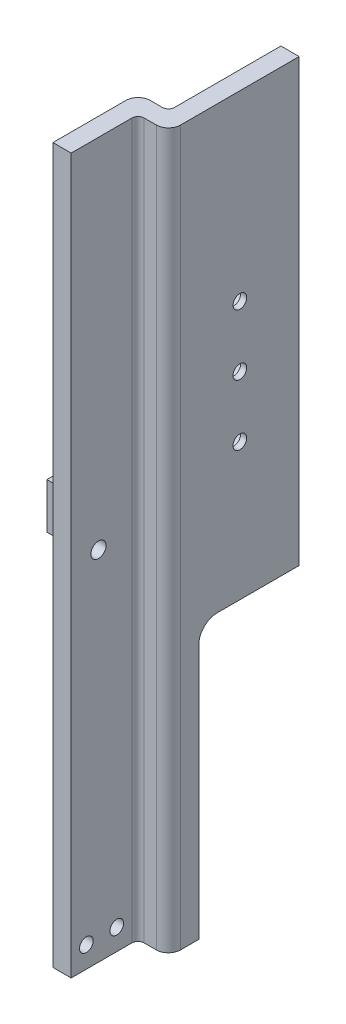
ISO-10303-21;
HEADER;
FILE_DESCRIPTION(('STEP AP214'),'2;1');
FILE_NAME('part.step','',(''),(''),'','','');
FILE_SCHEMA(('AUTOMOTIVE_DESIGN { 1 0 10303 214 1 1 1 1 }'));
ENDSEC;
DATA;
#1=APPLICATION_CONTEXT('core data for automotive mechanical design processes');
#2=APPLICATION_PROTOCOL_DEFINITION('international standard','automotive_design',2000,#1);
#3=PRODUCT_CONTEXT('',#1,'mechanical');
#4=PRODUCT('Part','Part','',(#3));
#5=PRODUCT_RELATED_PRODUCT_CATEGORY('part','',(#4));
#6=PRODUCT_DEFINITION_FORMATION('','',#4);
#7=PRODUCT_DEFINITION_CONTEXT('part definition',#1,'design');
#8=PRODUCT_DEFINITION('design','',#6,#7);
#9=PRODUCT_DEFINITION_SHAPE('','',#8);
#10=(LENGTH_UNIT() NAMED_UNIT(*) SI_UNIT(.MILLI.,.METRE.));
#11=(NAMED_UNIT(*) PLANE_ANGLE_UNIT() SI_UNIT($,.RADIAN.));
#12=(NAMED_UNIT(*) SI_UNIT($,.STERADIAN.) SOLID_ANGLE_UNIT());
#13=UNCERTAINTY_MEASURE_WITH_UNIT(LENGTH_MEASURE(1.E-05),#10,'distance_accuracy_value','');
#14=(GEOMETRIC_REPRESENTATION_CONTEXT(3) GLOBAL_UNCERTAINTY_ASSIGNED_CONTEXT((#13)) GLOBAL_UNIT_ASSIGNED_CONTEXT((#10,
#11,#12)) REPRESENTATION_CONTEXT('',''));
#15=CARTESIAN_POINT('',(0.,0.,0.));
#16=DIRECTION('',(0.,0.,1.));
#17=DIRECTION('',(1.,0.,0.));
#18=AXIS2_PLACEMENT_3D('',#15,#16,#17);
#19=CARTESIAN_POINT('',(-10.,0.,0.));
#20=DIRECTION('',(1.,0.,0.));
#21=DIRECTION('',(0.,0.,-1.));
#22=AXIS2_PLACEMENT_3D('',#19,#20,#21);
#23=PLANE('',#22);
#24=CARTESIAN_POINT('',(-10.,117.5,19.));
#25=DIRECTION('',(-1.,0.,0.));
#26=DIRECTION('',(0.,0.,1.));
#27=AXIS2_PLACEMENT_3D('',#24,#25,#26);
#28=CIRCLE('',#27,2.5);
#29=CARTESIAN_POINT('',(-10.,117.5,21.5));
#30=VERTEX_POINT('',#29);
#31=EDGE_CURVE('E445',#30,#30,#28,.T.);
#32=ORIENTED_EDGE('',*,*,#31,.F.);
#33=EDGE_LOOP('',(#32));
#34=FACE_BOUND('',#33,.T.);
#35=DIRECTION('',(0.,0.,1.));
#36=VECTOR('',#35,1.);
#37=CARTESIAN_POINT('',(-10.,110.,12.));
#38=LINE('',#37,#36);
#39=CARTESIAN_POINT('',(-10.,110.,4.));
#40=VERTEX_POINT('',#39);
#41=CARTESIAN_POINT('',(-10.,110.,15.));
#42=VERTEX_POINT('',#41);
#43=EDGE_CURVE('E62',#40,#42,#38,.T.);
#44=ORIENTED_EDGE('',*,*,#43,.F.);
#45=DIRECTION('',(0.,-1.,0.));
#46=VECTOR('',#45,1.);
#47=CARTESIAN_POINT('',(-10.,0.,4.));
#48=LINE('',#47,#46);
#49=CARTESIAN_POINT('',(-10.,0.,4.));
#50=VERTEX_POINT('',#49);
#51=EDGE_CURVE('E400',#40,#50,#48,.T.);
#52=ORIENTED_EDGE('',*,*,#51,.T.);
#53=DIRECTION('',(0.,0.,-1.));
#54=VECTOR('',#53,1.);
#55=CARTESIAN_POINT('',(-10.,0.,28.));
#56=LINE('',#55,#54);
#57=CARTESIAN_POINT('',(-10.,0.,28.));
#58=VERTEX_POINT('',#57);
#59=EDGE_CURVE('E338',#58,#50,#56,.T.);
#60=ORIENTED_EDGE('',*,*,#59,.F.);
#61=DIRECTION('',(0.,-1.,0.));
#62=VECTOR('',#61,1.);
#63=CARTESIAN_POINT('',(-10.,235.,28.));
#64=LINE('',#63,#62);
#65=CARTESIAN_POINT('',(-10.,235.,28.));
#66=VERTEX_POINT('',#65);
#67=EDGE_CURVE('E334',#66,#58,#64,.T.);
#68=ORIENTED_EDGE('',*,*,#67,.F.);
#69=DIRECTION('',(0.,0.,1.));
#70=VECTOR('',#69,1.);
#71=CARTESIAN_POINT('',(-10.,235.,-37.));
#72=LINE('',#71,#70);
#73=CARTESIAN_POINT('',(-10.,235.,4.));
#74=VERTEX_POINT('',#73);
#75=EDGE_CURVE('E343',#74,#66,#72,.T.);
#76=ORIENTED_EDGE('',*,*,#75,.F.);
#77=CARTESIAN_POINT('',(-10.,125.,4.));
#78=VERTEX_POINT('',#77);
#79=EDGE_CURVE('E401',#74,#78,#48,.T.);
#80=ORIENTED_EDGE('',*,*,#79,.T.);
#81=DIRECTION('',(0.,0.,-1.));
#82=VECTOR('',#81,1.);
#83=CARTESIAN_POINT('',(-10.,125.,12.));
#84=LINE('',#83,#82);
#85=CARTESIAN_POINT('',(-10.,125.,15.));
#86=VERTEX_POINT('',#85);
#87=EDGE_CURVE('E69',#86,#78,#84,.T.);
#88=ORIENTED_EDGE('',*,*,#87,.F.);
#89=DIRECTION('',(0.,1.,0.));
#90=VECTOR('',#89,1.);
#91=CARTESIAN_POINT('',(-10.,110.,15.));
#92=LINE('',#91,#90);
#93=EDGE_CURVE('E471',#42,#86,#92,.T.);
#94=ORIENTED_EDGE('',*,*,#93,.F.);
#95=EDGE_LOOP('',(#44,#52,#60,#68,#76,#80,#88,#94));
#96=FACE_BOUND('',#95,.T.);
#97=CARTESIAN_POINT('',(-10.,7.,13.));
#98=DIRECTION('',(1.,0.,0.));
#99=DIRECTION('',(0.,0.,-1.));
#100=AXIS2_PLACEMENT_3D('',#97,#98,#99);
#101=CIRCLE('',#100,2.24999999999997);
#102=CARTESIAN_POINT('',(-10.,7.,10.75));
#103=VERTEX_POINT('',#102);
#104=EDGE_CURVE('E228',#103,#103,#101,.T.);
#105=ORIENTED_EDGE('',*,*,#104,.T.);
#106=EDGE_LOOP('',(#105));
#107=FACE_BOUND('',#106,.T.);
#108=CARTESIAN_POINT('',(-10.,7.,23.));
#109=DIRECTION('',(1.,0.,0.));
#110=DIRECTION('',(0.,0.,-1.));
#111=AXIS2_PLACEMENT_3D('',#108,#109,#110);
#112=CIRCLE('',#111,2.24999999999997);
#113=CARTESIAN_POINT('',(-10.,7.,20.75));
#114=VERTEX_POINT('',#113);
#115=EDGE_CURVE('E215',#114,#114,#112,.T.);
#116=ORIENTED_EDGE('',*,*,#115,.T.);
#117=EDGE_LOOP('',(#116));
#118=FACE_BOUND('',#117,.T.);
#119=ADVANCED_FACE('F45',(#34,#96,#107,#118),#23,.F.);
#120=CARTESIAN_POINT('',(0.,235.,-37.));
#121=DIRECTION('',(1.,0.,0.));
#122=DIRECTION('',(0.,0.,-1.));
#123=AXIS2_PLACEMENT_3D('',#120,#121,#122);
#124=PLANE('',#123);
#125=CARTESIAN_POINT('',(0.,175.,-17.5));
#126=DIRECTION('',(-1.,0.,0.));
#127=DIRECTION('',(0.,0.,1.));
#128=AXIS2_PLACEMENT_3D('',#125,#126,#127);
#129=CIRCLE('',#128,4.);
#130=CARTESIAN_POINT('',(0.,175.,-13.5));
#131=VERTEX_POINT('',#130);
#132=EDGE_CURVE('E232',#131,#131,#129,.T.);
#133=ORIENTED_EDGE('',*,*,#132,.F.);
#134=EDGE_LOOP('',(#133));
#135=FACE_BOUND('',#134,.T.);
#136=CARTESIAN_POINT('',(0.,135.,-17.5));
#137=DIRECTION('',(-1.,0.,0.));
#138=DIRECTION('',(0.,0.,1.));
#139=AXIS2_PLACEMENT_3D('',#136,#137,#138);
#140=CIRCLE('',#139,4.);
#141=CARTESIAN_POINT('',(0.,135.,-13.5));
#142=VERTEX_POINT('',#141);
#143=EDGE_CURVE('E264',#142,#142,#140,.T.);
#144=ORIENTED_EDGE('',*,*,#143,.F.);
#145=EDGE_LOOP('',(#144));
#146=FACE_BOUND('',#145,.T.);
#147=DIRECTION('',(0.,0.,1.));
#148=VECTOR('',#147,1.);
#149=CARTESIAN_POINT('',(0.,0.,-37.));
#150=LINE('',#149,#148);
#151=CARTESIAN_POINT('',(0.,0.,-4.));
#152=VERTEX_POINT('',#151);
#153=CARTESIAN_POINT('',(0.,0.,-2.));
#154=VERTEX_POINT('',#153);
#155=EDGE_CURVE('E311',#152,#154,#150,.T.);
#156=ORIENTED_EDGE('',*,*,#155,.T.);
#157=DIRECTION('',(0.,-1.,0.));
#158=VECTOR('',#157,1.);
#159=CARTESIAN_POINT('',(0.,235.,-2.));
#160=LINE('',#159,#158);
#161=CARTESIAN_POINT('',(0.,235.,-2.));
#162=VERTEX_POINT('',#161);
#163=EDGE_CURVE('E378',#154,#162,#160,.F.);
#164=ORIENTED_EDGE('',*,*,#163,.T.);
#165=DIRECTION('',(0.,0.,1.));
#166=VECTOR('',#165,1.);
#167=CARTESIAN_POINT('',(0.,235.,-37.));
#168=LINE('',#167,#166);
#169=CARTESIAN_POINT('',(0.,235.,-37.));
#170=VERTEX_POINT('',#169);
#171=EDGE_CURVE('E314',#170,#162,#168,.T.);
#172=ORIENTED_EDGE('',*,*,#171,.F.);
#173=DIRECTION('',(0.,-1.,0.));
#174=VECTOR('',#173,1.);
#175=CARTESIAN_POINT('',(0.,235.,-37.));
#176=LINE('',#175,#174);
#177=CARTESIAN_POINT('',(0.,90.,-37.));
#178=VERTEX_POINT('',#177);
#179=EDGE_CURVE('E323',#170,#178,#176,.T.);
#180=ORIENTED_EDGE('',*,*,#179,.T.);
#181=DIRECTION('',(0.,0.,1.));
#182=VECTOR('',#181,1.);
#183=CARTESIAN_POINT('',(0.,90.,-37.));
#184=LINE('',#183,#182);
#185=CARTESIAN_POINT('',(0.,90.,-10.));
#186=VERTEX_POINT('',#185);
#187=EDGE_CURVE('E360',#178,#186,#184,.T.);
#188=ORIENTED_EDGE('',*,*,#187,.T.);
#189=CARTESIAN_POINT('',(0.,84.,-10.));
#190=DIRECTION('',(1.,0.,0.));
#191=DIRECTION('',(0.,0.,-1.));
#192=AXIS2_PLACEMENT_3D('',#189,#190,#191);
#193=CIRCLE('',#192,6.);
#194=CARTESIAN_POINT('',(0.,84.,-4.));
#195=VERTEX_POINT('',#194);
#196=EDGE_CURVE('E438',#186,#195,#193,.T.);
#197=ORIENTED_EDGE('',*,*,#196,.T.);
#198=DIRECTION('',(0.,-1.,0.));
#199=VECTOR('',#198,1.);
#200=CARTESIAN_POINT('',(0.,235.,-4.));
#201=LINE('',#200,#199);
#202=EDGE_CURVE('E371',#195,#152,#201,.T.);
#203=ORIENTED_EDGE('',*,*,#202,.T.);
#204=EDGE_LOOP('',(#156,#164,#172,#180,#188,#197,#203));
#205=FACE_BOUND('',#204,.T.);
#206=CARTESIAN_POINT('',(0.,155.,-17.5));
#207=DIRECTION('',(-1.,0.,0.));
#208=DIRECTION('',(0.,0.,1.));
#209=AXIS2_PLACEMENT_3D('',#206,#207,#208);
#210=CIRCLE('',#209,4.);
#211=CARTESIAN_POINT('',(0.,155.,-13.5));
#212=VERTEX_POINT('',#211);
#213=EDGE_CURVE('E248',#212,#212,#210,.T.);
#214=ORIENTED_EDGE('',*,*,#213,.F.);
#215=EDGE_LOOP('',(#214));
#216=FACE_BOUND('',#215,.T.);
#217=ADVANCED_FACE('F487',(#135,#146,#205,#216),#124,.F.);
#218=CARTESIAN_POINT('',(-10.,235.,28.));
#219=DIRECTION('',(0.,0.,1.));
#220=DIRECTION('',(1.,0.,0.));
#221=AXIS2_PLACEMENT_3D('',#218,#219,#220);
#222=PLANE('',#221);
#223=DIRECTION('',(0.,-1.,0.));
#224=VECTOR('',#223,1.);
#225=CARTESIAN_POINT('',(-4.,235.,28.));
#226=LINE('',#225,#224);
#227=CARTESIAN_POINT('',(-4.,235.,28.));
#228=VERTEX_POINT('',#227);
#229=CARTESIAN_POINT('',(-4.,0.,28.));
#230=VERTEX_POINT('',#229);
#231=EDGE_CURVE('E290',#228,#230,#226,.T.);
#232=ORIENTED_EDGE('',*,*,#231,.F.);
#233=DIRECTION('',(1.,0.,0.));
#234=VECTOR('',#233,1.);
#235=CARTESIAN_POINT('',(-10.,235.,28.));
#236=LINE('',#235,#234);
#237=EDGE_CURVE('E356',#66,#228,#236,.T.);
#238=ORIENTED_EDGE('',*,*,#237,.F.);
#239=ORIENTED_EDGE('',*,*,#67,.T.);
#240=DIRECTION('',(1.,0.,0.));
#241=VECTOR('',#240,1.);
#242=CARTESIAN_POINT('',(-10.,0.,28.));
#243=LINE('',#242,#241);
#244=EDGE_CURVE('E346',#58,#230,#243,.T.);
#245=ORIENTED_EDGE('',*,*,#244,.T.);
#246=EDGE_LOOP('',(#232,#238,#239,#245));
#247=FACE_BOUND('',#246,.T.);
#248=ADVANCED_FACE('F568',(#247),#222,.T.);
#249=CARTESIAN_POINT('',(-10.,235.,-37.));
#250=DIRECTION('',(0.,1.,0.));
#251=DIRECTION('',(0.,0.,1.));
#252=AXIS2_PLACEMENT_3D('',#249,#250,#251);
#253=PLANE('',#252);
#254=DIRECTION('',(-1.,0.,0.));
#255=VECTOR('',#254,1.);
#256=CARTESIAN_POINT('',(0.,235.,0.));
#257=LINE('',#256,#255);
#258=CARTESIAN_POINT('',(-2.,235.,0.));
#259=VERTEX_POINT('',#258);
#260=CARTESIAN_POINT('',(-6.,235.,0.));
#261=VERTEX_POINT('',#260);
#262=EDGE_CURVE('E318',#259,#261,#257,.T.);
#263=ORIENTED_EDGE('',*,*,#262,.T.);
#264=CARTESIAN_POINT('',(-6.,235.,4.));
#265=DIRECTION('',(0.,1.,0.));
#266=DIRECTION('',(0.,0.,1.));
#267=AXIS2_PLACEMENT_3D('',#264,#265,#266);
#268=CIRCLE('',#267,4.);
#269=EDGE_CURVE('E418',#261,#74,#268,.T.);
#270=ORIENTED_EDGE('',*,*,#269,.T.);
#271=ORIENTED_EDGE('',*,*,#75,.T.);
#272=ORIENTED_EDGE('',*,*,#237,.T.);
#273=DIRECTION('',(0.,0.,-1.));
#274=VECTOR('',#273,1.);
#275=CARTESIAN_POINT('',(-4.,235.,28.));
#276=LINE('',#275,#274);
#277=CARTESIAN_POINT('',(-4.,235.,8.));
#278=VERTEX_POINT('',#277);
#279=EDGE_CURVE('E281',#228,#278,#276,.T.);
#280=ORIENTED_EDGE('',*,*,#279,.T.);
#281=CARTESIAN_POINT('',(-2.,235.,8.));
#282=DIRECTION('',(0.,1.,0.));
#283=DIRECTION('',(0.,0.,1.));
#284=AXIS2_PLACEMENT_3D('',#281,#282,#283);
#285=CIRCLE('',#284,2.);
#286=CARTESIAN_POINT('',(-2.,235.,6.));
#287=VERTEX_POINT('',#286);
#288=EDGE_CURVE('E397',#278,#287,#285,.F.);
#289=ORIENTED_EDGE('',*,*,#288,.T.);
#290=DIRECTION('',(1.,0.,0.));
#291=VECTOR('',#290,1.);
#292=CARTESIAN_POINT('',(-4.,235.,6.));
#293=LINE('',#292,#291);
#294=CARTESIAN_POINT('',(2.,235.,6.));
#295=VERTEX_POINT('',#294);
#296=EDGE_CURVE('E285',#287,#295,#293,.T.);
#297=ORIENTED_EDGE('',*,*,#296,.T.);
#298=CARTESIAN_POINT('',(2.,235.,2.));
#299=DIRECTION('',(0.,1.,0.));
#300=DIRECTION('',(0.,0.,1.));
#301=AXIS2_PLACEMENT_3D('',#298,#299,#300);
#302=CIRCLE('',#301,4.);
#303=CARTESIAN_POINT('',(6.,235.,2.));
#304=VERTEX_POINT('',#303);
#305=EDGE_CURVE('E415',#295,#304,#302,.T.);
#306=ORIENTED_EDGE('',*,*,#305,.T.);
#307=DIRECTION('',(0.,0.,1.));
#308=VECTOR('',#307,1.);
#309=CARTESIAN_POINT('',(6.,235.,-37.));
#310=LINE('',#309,#308);
#311=CARTESIAN_POINT('',(6.,235.,-37.));
#312=VERTEX_POINT('',#311);
#313=EDGE_CURVE('E339',#312,#304,#310,.T.);
#314=ORIENTED_EDGE('',*,*,#313,.F.);
#315=DIRECTION('',(1.,0.,0.));
#316=VECTOR('',#315,1.);
#317=CARTESIAN_POINT('',(-10.,235.,-37.));
#318=LINE('',#317,#316);
#319=EDGE_CURVE('E361',#170,#312,#318,.T.);
#320=ORIENTED_EDGE('',*,*,#319,.F.);
#321=ORIENTED_EDGE('',*,*,#171,.T.);
#322=CARTESIAN_POINT('',(-2.,235.,-2.));
#323=DIRECTION('',(0.,1.,0.));
#324=DIRECTION('',(0.,0.,1.));
#325=AXIS2_PLACEMENT_3D('',#322,#323,#324);
#326=CIRCLE('',#325,2.);
#327=EDGE_CURVE('E391',#162,#259,#326,.F.);
#328=ORIENTED_EDGE('',*,*,#327,.T.);
#329=EDGE_LOOP('',(#263,#270,#271,#272,#280,#289,#297,#306,#314,#320,#321,#328));
#330=FACE_BOUND('',#329,.T.);
#331=ADVANCED_FACE('F575',(#330),#253,.T.);
#332=CARTESIAN_POINT('',(-10.,0.,-37.));
#333=DIRECTION('',(0.,0.,-1.));
#334=DIRECTION('',(-1.,0.,0.));
#335=AXIS2_PLACEMENT_3D('',#332,#333,#334);
#336=PLANE('',#335);
#337=DIRECTION('',(1.,0.,0.));
#338=VECTOR('',#337,1.);
#339=CARTESIAN_POINT('',(-10.,90.,-37.));
#340=LINE('',#339,#338);
#341=CARTESIAN_POINT('',(6.,90.,-37.));
#342=VERTEX_POINT('',#341);
#343=EDGE_CURVE('E306',#178,#342,#340,.T.);
#344=ORIENTED_EDGE('',*,*,#343,.F.);
#345=ORIENTED_EDGE('',*,*,#179,.F.);
#346=ORIENTED_EDGE('',*,*,#319,.T.);
#347=DIRECTION('',(0.,1.,0.));
#348=VECTOR('',#347,1.);
#349=CARTESIAN_POINT('',(6.,0.,-37.));
#350=LINE('',#349,#348);
#351=EDGE_CURVE('E350',#342,#312,#350,.T.);
#352=ORIENTED_EDGE('',*,*,#351,.F.);
#353=EDGE_LOOP('',(#344,#345,#346,#352));
#354=FACE_BOUND('',#353,.T.);
#355=ADVANCED_FACE('F578',(#354),#336,.T.);
#356=CARTESIAN_POINT('',(-10.,0.,28.));
#357=DIRECTION('',(0.,-1.,0.));
#358=DIRECTION('',(0.,0.,-1.));
#359=AXIS2_PLACEMENT_3D('',#356,#357,#358);
#360=PLANE('',#359);
#361=ORIENTED_EDGE('',*,*,#59,.T.);
#362=CARTESIAN_POINT('',(-6.,0.,4.));
#363=DIRECTION('',(0.,-1.,0.));
#364=DIRECTION('',(0.,0.,-1.));
#365=AXIS2_PLACEMENT_3D('',#362,#363,#364);
#366=CIRCLE('',#365,4.);
#367=CARTESIAN_POINT('',(-6.,0.,0.));
#368=VERTEX_POINT('',#367);
#369=EDGE_CURVE('E409',#50,#368,#366,.T.);
#370=ORIENTED_EDGE('',*,*,#369,.T.);
#371=DIRECTION('',(-1.,0.,0.));
#372=VECTOR('',#371,1.);
#373=CARTESIAN_POINT('',(0.,0.,0.));
#374=LINE('',#373,#372);
#375=CARTESIAN_POINT('',(-2.,0.,0.));
#376=VERTEX_POINT('',#375);
#377=EDGE_CURVE('E319',#376,#368,#374,.T.);
#378=ORIENTED_EDGE('',*,*,#377,.F.);
#379=CARTESIAN_POINT('',(-2.,0.,-2.));
#380=DIRECTION('',(0.,-1.,0.));
#381=DIRECTION('',(0.,0.,-1.));
#382=AXIS2_PLACEMENT_3D('',#379,#380,#381);
#383=CIRCLE('',#382,2.);
#384=EDGE_CURVE('E388',#376,#154,#383,.F.);
#385=ORIENTED_EDGE('',*,*,#384,.T.);
#386=ORIENTED_EDGE('',*,*,#155,.F.);
#387=DIRECTION('',(1.,0.,0.));
#388=VECTOR('',#387,1.);
#389=CARTESIAN_POINT('',(-10.,0.,-4.));
#390=LINE('',#389,#388);
#391=CARTESIAN_POINT('',(6.,0.,-4.));
#392=VERTEX_POINT('',#391);
#393=EDGE_CURVE('E307',#152,#392,#390,.T.);
#394=ORIENTED_EDGE('',*,*,#393,.T.);
#395=DIRECTION('',(0.,0.,-1.));
#396=VECTOR('',#395,1.);
#397=CARTESIAN_POINT('',(6.,0.,28.));
#398=LINE('',#397,#396);
#399=CARTESIAN_POINT('',(6.,0.,2.));
#400=VERTEX_POINT('',#399);
#401=EDGE_CURVE('E333',#400,#392,#398,.T.);
#402=ORIENTED_EDGE('',*,*,#401,.F.);
#403=CARTESIAN_POINT('',(2.,0.,2.));
#404=DIRECTION('',(0.,-1.,0.));
#405=DIRECTION('',(0.,0.,-1.));
#406=AXIS2_PLACEMENT_3D('',#403,#404,#405);
#407=CIRCLE('',#406,4.);
#408=CARTESIAN_POINT('',(2.,0.,6.));
#409=VERTEX_POINT('',#408);
#410=EDGE_CURVE('E405',#400,#409,#407,.T.);
#411=ORIENTED_EDGE('',*,*,#410,.T.);
#412=DIRECTION('',(1.,0.,0.));
#413=VECTOR('',#412,1.);
#414=CARTESIAN_POINT('',(-4.,0.,6.));
#415=LINE('',#414,#413);
#416=CARTESIAN_POINT('',(-2.,0.,6.));
#417=VERTEX_POINT('',#416);
#418=EDGE_CURVE('E286',#417,#409,#415,.T.);
#419=ORIENTED_EDGE('',*,*,#418,.F.);
#420=CARTESIAN_POINT('',(-2.,0.,8.));
#421=DIRECTION('',(0.,-1.,0.));
#422=DIRECTION('',(0.,0.,-1.));
#423=AXIS2_PLACEMENT_3D('',#420,#421,#422);
#424=CIRCLE('',#423,2.);
#425=CARTESIAN_POINT('',(-4.,0.,8.));
#426=VERTEX_POINT('',#425);
#427=EDGE_CURVE('E394',#417,#426,#424,.F.);
#428=ORIENTED_EDGE('',*,*,#427,.T.);
#429=DIRECTION('',(0.,0.,-1.));
#430=VECTOR('',#429,1.);
#431=CARTESIAN_POINT('',(-4.,0.,28.));
#432=LINE('',#431,#430);
#433=EDGE_CURVE('E280',#230,#426,#432,.T.);
#434=ORIENTED_EDGE('',*,*,#433,.F.);
#435=ORIENTED_EDGE('',*,*,#244,.F.);
#436=EDGE_LOOP('',(#361,#370,#378,#385,#386,#394,#402,#411,#419,#428,#434,#435));
#437=FACE_BOUND('',#436,.T.);
#438=ADVANCED_FACE('F573',(#437),#360,.T.);
#439=CARTESIAN_POINT('',(6.,0.,0.));
#440=DIRECTION('',(1.,0.,0.));
#441=DIRECTION('',(0.,0.,-1.));
#442=AXIS2_PLACEMENT_3D('',#439,#440,#441);
#443=PLANE('',#442);
#444=CARTESIAN_POINT('',(6.00000000000001,175.,-17.5));
#445=DIRECTION('',(-1.,0.,0.));
#446=DIRECTION('',(0.,0.,1.));
#447=AXIS2_PLACEMENT_3D('',#444,#445,#446);
#448=CIRCLE('',#447,2.25);
#449=CARTESIAN_POINT('',(6.00000000000001,175.,-15.25));
#450=VERTEX_POINT('',#449);
#451=EDGE_CURVE('E244',#450,#450,#448,.T.);
#452=ORIENTED_EDGE('',*,*,#451,.T.);
#453=EDGE_LOOP('',(#452));
#454=FACE_BOUND('',#453,.T.);
#455=CARTESIAN_POINT('',(6.00000000000001,155.,-17.5));
#456=DIRECTION('',(-1.,0.,0.));
#457=DIRECTION('',(0.,0.,1.));
#458=AXIS2_PLACEMENT_3D('',#455,#456,#457);
#459=CIRCLE('',#458,2.25);
#460=CARTESIAN_POINT('',(6.00000000000001,155.,-15.25));
#461=VERTEX_POINT('',#460);
#462=EDGE_CURVE('E260',#461,#461,#459,.T.);
#463=ORIENTED_EDGE('',*,*,#462,.T.);
#464=EDGE_LOOP('',(#463));
#465=FACE_BOUND('',#464,.T.);
#466=CARTESIAN_POINT('',(6.00000000000001,135.,-17.5));
#467=DIRECTION('',(-1.,0.,0.));
#468=DIRECTION('',(0.,0.,1.));
#469=AXIS2_PLACEMENT_3D('',#466,#467,#468);
#470=CIRCLE('',#469,2.25);
#471=CARTESIAN_POINT('',(6.00000000000001,135.,-15.25));
#472=VERTEX_POINT('',#471);
#473=EDGE_CURVE('E276',#472,#472,#470,.T.);
#474=ORIENTED_EDGE('',*,*,#473,.T.);
#475=EDGE_LOOP('',(#474));
#476=FACE_BOUND('',#475,.T.);
#477=ORIENTED_EDGE('',*,*,#313,.T.);
#478=DIRECTION('',(0.,-1.,0.));
#479=VECTOR('',#478,1.);
#480=CARTESIAN_POINT('',(6.,0.,2.));
#481=LINE('',#480,#479);
#482=EDGE_CURVE('E421',#304,#400,#481,.T.);
#483=ORIENTED_EDGE('',*,*,#482,.T.);
#484=ORIENTED_EDGE('',*,*,#401,.T.);
#485=DIRECTION('',(0.,-1.,0.));
#486=VECTOR('',#485,1.);
#487=CARTESIAN_POINT('',(6.,90.,-4.));
#488=LINE('',#487,#486);
#489=CARTESIAN_POINT('',(6.,84.,-4.));
#490=VERTEX_POINT('',#489);
#491=EDGE_CURVE('E303',#490,#392,#488,.T.);
#492=ORIENTED_EDGE('',*,*,#491,.F.);
#493=CARTESIAN_POINT('',(6.,84.,-10.));
#494=DIRECTION('',(1.,0.,0.));
#495=DIRECTION('',(0.,0.,-1.));
#496=AXIS2_PLACEMENT_3D('',#493,#494,#495);
#497=CIRCLE('',#496,6.);
#498=CARTESIAN_POINT('',(6.,90.,-10.));
#499=VERTEX_POINT('',#498);
#500=EDGE_CURVE('E435',#490,#499,#497,.F.);
#501=ORIENTED_EDGE('',*,*,#500,.T.);
#502=DIRECTION('',(0.,0.,1.));
#503=VECTOR('',#502,1.);
#504=CARTESIAN_POINT('',(6.,90.,-37.));
#505=LINE('',#504,#503);
#506=EDGE_CURVE('E299',#342,#499,#505,.T.);
#507=ORIENTED_EDGE('',*,*,#506,.F.);
#508=ORIENTED_EDGE('',*,*,#351,.T.);
#509=EDGE_LOOP('',(#477,#483,#484,#492,#501,#507,#508));
#510=FACE_BOUND('',#509,.T.);
#511=ADVANCED_FACE('F565',(#454,#465,#476,#510),#443,.T.);
#512=CARTESIAN_POINT('',(0.,235.,0.));
#513=DIRECTION('',(0.,0.,1.));
#514=DIRECTION('',(1.,0.,0.));
#515=AXIS2_PLACEMENT_3D('',#512,#513,#514);
#516=PLANE('',#515);
#517=ORIENTED_EDGE('',*,*,#377,.T.);
#518=DIRECTION('',(0.,-1.,0.));
#519=VECTOR('',#518,1.);
#520=CARTESIAN_POINT('',(-6.,235.,0.));
#521=LINE('',#520,#519);
#522=EDGE_CURVE('E412',#368,#261,#521,.F.);
#523=ORIENTED_EDGE('',*,*,#522,.T.);
#524=ORIENTED_EDGE('',*,*,#262,.F.);
#525=DIRECTION('',(0.,-1.,0.));
#526=VECTOR('',#525,1.);
#527=CARTESIAN_POINT('',(-2.,0.,0.));
#528=LINE('',#527,#526);
#529=EDGE_CURVE('E374',#259,#376,#528,.T.);
#530=ORIENTED_EDGE('',*,*,#529,.T.);
#531=EDGE_LOOP('',(#517,#523,#524,#530));
#532=FACE_BOUND('',#531,.T.);
#533=ADVANCED_FACE('F558',(#532),#516,.F.);
#534=CARTESIAN_POINT('',(-10.,90.,-4.));
#535=DIRECTION('',(0.,0.,1.));
#536=DIRECTION('',(1.,0.,0.));
#537=AXIS2_PLACEMENT_3D('',#534,#535,#536);
#538=PLANE('',#537);
#539=ORIENTED_EDGE('',*,*,#202,.F.);
#540=DIRECTION('',(1.,0.,0.));
#541=VECTOR('',#540,1.);
#542=CARTESIAN_POINT('',(6.,84.,-4.));
#543=LINE('',#542,#541);
#544=EDGE_CURVE('E428',#195,#490,#543,.T.);
#545=ORIENTED_EDGE('',*,*,#544,.T.);
#546=ORIENTED_EDGE('',*,*,#491,.T.);
#547=ORIENTED_EDGE('',*,*,#393,.F.);
#548=EDGE_LOOP('',(#539,#545,#546,#547));
#549=FACE_BOUND('',#548,.T.);
#550=ADVANCED_FACE('F555',(#549),#538,.F.);
#551=CARTESIAN_POINT('',(-10.,90.,-37.));
#552=DIRECTION('',(0.,1.,0.));
#553=DIRECTION('',(0.,0.,1.));
#554=AXIS2_PLACEMENT_3D('',#551,#552,#553);
#555=PLANE('',#554);
#556=ORIENTED_EDGE('',*,*,#506,.T.);
#557=DIRECTION('',(1.,0.,0.));
#558=VECTOR('',#557,1.);
#559=CARTESIAN_POINT('',(0.,90.,-10.));
#560=LINE('',#559,#558);
#561=EDGE_CURVE('E432',#499,#186,#560,.F.);
#562=ORIENTED_EDGE('',*,*,#561,.T.);
#563=ORIENTED_EDGE('',*,*,#187,.F.);
#564=ORIENTED_EDGE('',*,*,#343,.T.);
#565=EDGE_LOOP('',(#556,#562,#563,#564));
#566=FACE_BOUND('',#565,.T.);
#567=ADVANCED_FACE('F550',(#566),#555,.F.);
#568=CARTESIAN_POINT('',(-4.,235.,6.));
#569=DIRECTION('',(0.,0.,-1.));
#570=DIRECTION('',(-1.,0.,0.));
#571=AXIS2_PLACEMENT_3D('',#568,#569,#570);
#572=PLANE('',#571);
#573=ORIENTED_EDGE('',*,*,#418,.T.);
#574=DIRECTION('',(0.,-1.,0.));
#575=VECTOR('',#574,1.);
#576=CARTESIAN_POINT('',(2.,235.,6.));
#577=LINE('',#576,#575);
#578=EDGE_CURVE('E425',#409,#295,#577,.F.);
#579=ORIENTED_EDGE('',*,*,#578,.T.);
#580=ORIENTED_EDGE('',*,*,#296,.F.);
#581=DIRECTION('',(0.,-1.,0.));
#582=VECTOR('',#581,1.);
#583=CARTESIAN_POINT('',(-2.,0.,6.));
#584=LINE('',#583,#582);
#585=EDGE_CURVE('E381',#287,#417,#584,.T.);
#586=ORIENTED_EDGE('',*,*,#585,.T.);
#587=EDGE_LOOP('',(#573,#579,#580,#586));
#588=FACE_BOUND('',#587,.T.);
#589=ADVANCED_FACE('F547',(#588),#572,.F.);
#590=CARTESIAN_POINT('',(-4.,235.,28.));
#591=DIRECTION('',(-1.,0.,0.));
#592=DIRECTION('',(0.,0.,1.));
#593=AXIS2_PLACEMENT_3D('',#590,#591,#592);
#594=PLANE('',#593);
#595=CARTESIAN_POINT('',(-4.,117.5,19.));
#596=DIRECTION('',(-1.,0.,0.));
#597=DIRECTION('',(0.,0.,1.));
#598=AXIS2_PLACEMENT_3D('',#595,#596,#597);
#599=CIRCLE('',#598,2.5);
#600=CARTESIAN_POINT('',(-4.,117.5,21.5));
#601=VERTEX_POINT('',#600);
#602=EDGE_CURVE('E441',#601,#601,#599,.T.);
#603=ORIENTED_EDGE('',*,*,#602,.T.);
#604=EDGE_LOOP('',(#603));
#605=FACE_BOUND('',#604,.T.);
#606=CARTESIAN_POINT('',(-4.,7.,23.));
#607=DIRECTION('',(1.,0.,0.));
#608=DIRECTION('',(0.,0.,-1.));
#609=AXIS2_PLACEMENT_3D('',#606,#607,#608);
#610=CIRCLE('',#609,2.24999999999998);
#611=CARTESIAN_POINT('',(-4.,7.,20.75));
#612=VERTEX_POINT('',#611);
#613=EDGE_CURVE('E210',#612,#612,#610,.T.);
#614=ORIENTED_EDGE('',*,*,#613,.F.);
#615=EDGE_LOOP('',(#614));
#616=FACE_BOUND('',#615,.T.);
#617=CARTESIAN_POINT('',(-4.,7.,13.));
#618=DIRECTION('',(1.,0.,0.));
#619=DIRECTION('',(0.,0.,-1.));
#620=AXIS2_PLACEMENT_3D('',#617,#618,#619);
#621=CIRCLE('',#620,2.24999999999998);
#622=CARTESIAN_POINT('',(-4.,7.,10.75));
#623=VERTEX_POINT('',#622);
#624=EDGE_CURVE('E224',#623,#623,#621,.T.);
#625=ORIENTED_EDGE('',*,*,#624,.F.);
#626=EDGE_LOOP('',(#625));
#627=FACE_BOUND('',#626,.T.);
#628=ORIENTED_EDGE('',*,*,#433,.T.);
#629=DIRECTION('',(0.,-1.,0.));
#630=VECTOR('',#629,1.);
#631=CARTESIAN_POINT('',(-4.,235.,8.));
#632=LINE('',#631,#630);
#633=EDGE_CURVE('E385',#426,#278,#632,.F.);
#634=ORIENTED_EDGE('',*,*,#633,.T.);
#635=ORIENTED_EDGE('',*,*,#279,.F.);
#636=ORIENTED_EDGE('',*,*,#231,.T.);
#637=EDGE_LOOP('',(#628,#634,#635,#636));
#638=FACE_BOUND('',#637,.T.);
#639=ADVANCED_FACE('F545',(#605,#616,#627,#638),#594,.F.);
#640=CARTESIAN_POINT('',(0.,135.,-17.5));
#641=DIRECTION('',(-1.,0.,0.));
#642=DIRECTION('',(0.,0.,1.));
#643=AXIS2_PLACEMENT_3D('',#640,#641,#642);
#644=CYLINDRICAL_SURFACE('',#643,2.25);
#645=ORIENTED_EDGE('',*,*,#473,.F.);
#646=EDGE_LOOP('',(#645));
#647=FACE_BOUND('',#646,.T.);
#648=CARTESIAN_POINT('',(3.99999999999999,135.,-17.5));
#649=DIRECTION('',(-1.,0.,0.));
#650=DIRECTION('',(0.,0.,1.));
#651=AXIS2_PLACEMENT_3D('',#648,#649,#650);
#652=CIRCLE('',#651,2.25);
#653=CARTESIAN_POINT('',(3.99999999999999,135.,-15.25));
#654=VERTEX_POINT('',#653);
#655=EDGE_CURVE('E272',#654,#654,#652,.T.);
#656=ORIENTED_EDGE('',*,*,#655,.T.);
#657=EDGE_LOOP('',(#656));
#658=FACE_BOUND('',#657,.T.);
#659=ADVANCED_FACE('F541',(#647,#658),#644,.F.);
#660=CARTESIAN_POINT('',(3.99999999999999,137.25,-17.5));
#661=DIRECTION('',(1.,0.,0.));
#662=DIRECTION('',(0.,0.,-1.));
#663=AXIS2_PLACEMENT_3D('',#660,#661,#662);
#664=PLANE('',#663);
#665=ORIENTED_EDGE('',*,*,#655,.F.);
#666=EDGE_LOOP('',(#665));
#667=FACE_BOUND('',#666,.T.);
#668=CARTESIAN_POINT('',(3.99999999999999,135.,-17.5));
#669=DIRECTION('',(-1.,0.,0.));
#670=DIRECTION('',(0.,0.,1.));
#671=AXIS2_PLACEMENT_3D('',#668,#669,#670);
#672=CIRCLE('',#671,4.);
#673=CARTESIAN_POINT('',(3.99999999999999,135.,-13.5));
#674=VERTEX_POINT('',#673);
#675=EDGE_CURVE('E268',#674,#674,#672,.T.);
#676=ORIENTED_EDGE('',*,*,#675,.T.);
#677=EDGE_LOOP('',(#676));
#678=FACE_BOUND('',#677,.T.);
#679=ADVANCED_FACE('F537',(#667,#678),#664,.F.);
#680=CARTESIAN_POINT('',(0.,135.,-17.5));
#681=DIRECTION('',(-1.,0.,0.));
#682=DIRECTION('',(0.,0.,1.));
#683=AXIS2_PLACEMENT_3D('',#680,#681,#682);
#684=CYLINDRICAL_SURFACE('',#683,4.);
#685=ORIENTED_EDGE('',*,*,#675,.F.);
#686=EDGE_LOOP('',(#685));
#687=FACE_BOUND('',#686,.T.);
#688=ORIENTED_EDGE('',*,*,#143,.T.);
#689=EDGE_LOOP('',(#688));
#690=FACE_BOUND('',#689,.T.);
#691=ADVANCED_FACE('F533',(#687,#690),#684,.F.);
#692=CARTESIAN_POINT('',(0.,155.,-17.5));
#693=DIRECTION('',(-1.,0.,0.));
#694=DIRECTION('',(0.,0.,1.));
#695=AXIS2_PLACEMENT_3D('',#692,#693,#694);
#696=CYLINDRICAL_SURFACE('',#695,2.25);
#697=ORIENTED_EDGE('',*,*,#462,.F.);
#698=EDGE_LOOP('',(#697));
#699=FACE_BOUND('',#698,.T.);
#700=CARTESIAN_POINT('',(3.99999999999999,155.,-17.5));
#701=DIRECTION('',(-1.,0.,0.));
#702=DIRECTION('',(0.,0.,1.));
#703=AXIS2_PLACEMENT_3D('',#700,#701,#702);
#704=CIRCLE('',#703,2.25);
#705=CARTESIAN_POINT('',(3.99999999999999,155.,-15.25));
#706=VERTEX_POINT('',#705);
#707=EDGE_CURVE('E256',#706,#706,#704,.T.);
#708=ORIENTED_EDGE('',*,*,#707,.T.);
#709=EDGE_LOOP('',(#708));
#710=FACE_BOUND('',#709,.T.);
#711=ADVANCED_FACE('F529',(#699,#710),#696,.F.);
#712=CARTESIAN_POINT('',(3.99999999999999,157.25,-17.5));
#713=DIRECTION('',(1.,0.,0.));
#714=DIRECTION('',(0.,0.,-1.));
#715=AXIS2_PLACEMENT_3D('',#712,#713,#714);
#716=PLANE('',#715);
#717=ORIENTED_EDGE('',*,*,#707,.F.);
#718=EDGE_LOOP('',(#717));
#719=FACE_BOUND('',#718,.T.);
#720=CARTESIAN_POINT('',(3.99999999999999,155.,-17.5));
#721=DIRECTION('',(-1.,0.,0.));
#722=DIRECTION('',(0.,0.,1.));
#723=AXIS2_PLACEMENT_3D('',#720,#721,#722);
#724=CIRCLE('',#723,4.);
#725=CARTESIAN_POINT('',(3.99999999999999,155.,-13.5));
#726=VERTEX_POINT('',#725);
#727=EDGE_CURVE('E252',#726,#726,#724,.T.);
#728=ORIENTED_EDGE('',*,*,#727,.T.);
#729=EDGE_LOOP('',(#728));
#730=FACE_BOUND('',#729,.T.);
#731=ADVANCED_FACE('F525',(#719,#730),#716,.F.);
#732=CARTESIAN_POINT('',(0.,155.,-17.5));
#733=DIRECTION('',(-1.,0.,0.));
#734=DIRECTION('',(0.,0.,1.));
#735=AXIS2_PLACEMENT_3D('',#732,#733,#734);
#736=CYLINDRICAL_SURFACE('',#735,4.);
#737=ORIENTED_EDGE('',*,*,#727,.F.);
#738=EDGE_LOOP('',(#737));
#739=FACE_BOUND('',#738,.T.);
#740=ORIENTED_EDGE('',*,*,#213,.T.);
#741=EDGE_LOOP('',(#740));
#742=FACE_BOUND('',#741,.T.);
#743=ADVANCED_FACE('F521',(#739,#742),#736,.F.);
#744=CARTESIAN_POINT('',(0.,175.,-17.5));
#745=DIRECTION('',(-1.,0.,0.));
#746=DIRECTION('',(0.,0.,1.));
#747=AXIS2_PLACEMENT_3D('',#744,#745,#746);
#748=CYLINDRICAL_SURFACE('',#747,2.25);
#749=ORIENTED_EDGE('',*,*,#451,.F.);
#750=EDGE_LOOP('',(#749));
#751=FACE_BOUND('',#750,.T.);
#752=CARTESIAN_POINT('',(3.99999999999999,175.,-17.5));
#753=DIRECTION('',(-1.,0.,0.));
#754=DIRECTION('',(0.,0.,1.));
#755=AXIS2_PLACEMENT_3D('',#752,#753,#754);
#756=CIRCLE('',#755,2.25);
#757=CARTESIAN_POINT('',(3.99999999999999,175.,-15.25));
#758=VERTEX_POINT('',#757);
#759=EDGE_CURVE('E240',#758,#758,#756,.T.);
#760=ORIENTED_EDGE('',*,*,#759,.T.);
#761=EDGE_LOOP('',(#760));
#762=FACE_BOUND('',#761,.T.);
#763=ADVANCED_FACE('F517',(#751,#762),#748,.F.);
#764=CARTESIAN_POINT('',(3.99999999999999,177.25,-17.5));
#765=DIRECTION('',(1.,0.,0.));
#766=DIRECTION('',(0.,0.,-1.));
#767=AXIS2_PLACEMENT_3D('',#764,#765,#766);
#768=PLANE('',#767);
#769=ORIENTED_EDGE('',*,*,#759,.F.);
#770=EDGE_LOOP('',(#769));
#771=FACE_BOUND('',#770,.T.);
#772=CARTESIAN_POINT('',(3.99999999999999,175.,-17.5));
#773=DIRECTION('',(-1.,0.,0.));
#774=DIRECTION('',(0.,0.,1.));
#775=AXIS2_PLACEMENT_3D('',#772,#773,#774);
#776=CIRCLE('',#775,4.);
#777=CARTESIAN_POINT('',(3.99999999999999,175.,-13.5));
#778=VERTEX_POINT('',#777);
#779=EDGE_CURVE('E236',#778,#778,#776,.T.);
#780=ORIENTED_EDGE('',*,*,#779,.T.);
#781=EDGE_LOOP('',(#780));
#782=FACE_BOUND('',#781,.T.);
#783=ADVANCED_FACE('F513',(#771,#782),#768,.F.);
#784=CARTESIAN_POINT('',(0.,175.,-17.5));
#785=DIRECTION('',(-1.,0.,0.));
#786=DIRECTION('',(0.,0.,1.));
#787=AXIS2_PLACEMENT_3D('',#784,#785,#786);
#788=CYLINDRICAL_SURFACE('',#787,4.);
#789=ORIENTED_EDGE('',*,*,#779,.F.);
#790=EDGE_LOOP('',(#789));
#791=FACE_BOUND('',#790,.T.);
#792=ORIENTED_EDGE('',*,*,#132,.T.);
#793=EDGE_LOOP('',(#792));
#794=FACE_BOUND('',#793,.T.);
#795=ADVANCED_FACE('F509',(#791,#794),#788,.F.);
#796=CARTESIAN_POINT('',(-2.,235.,-2.));
#797=DIRECTION('',(0.,1.,0.));
#798=DIRECTION('',(0.,0.,1.));
#799=AXIS2_PLACEMENT_3D('',#796,#797,#798);
#800=CYLINDRICAL_SURFACE('',#799,2.);
#801=ORIENTED_EDGE('',*,*,#327,.F.);
#802=ORIENTED_EDGE('',*,*,#163,.F.);
#803=ORIENTED_EDGE('',*,*,#384,.F.);
#804=ORIENTED_EDGE('',*,*,#529,.F.);
#805=EDGE_LOOP('',(#801,#802,#803,#804));
#806=FACE_BOUND('',#805,.T.);
#807=ADVANCED_FACE('F512',(#806),#800,.F.);
#808=CARTESIAN_POINT('',(-2.,235.,8.));
#809=DIRECTION('',(0.,1.,0.));
#810=DIRECTION('',(0.,0.,1.));
#811=AXIS2_PLACEMENT_3D('',#808,#809,#810);
#812=CYLINDRICAL_SURFACE('',#811,2.);
#813=ORIENTED_EDGE('',*,*,#288,.F.);
#814=ORIENTED_EDGE('',*,*,#633,.F.);
#815=ORIENTED_EDGE('',*,*,#427,.F.);
#816=ORIENTED_EDGE('',*,*,#585,.F.);
#817=EDGE_LOOP('',(#813,#814,#815,#816));
#818=FACE_BOUND('',#817,.T.);
#819=ADVANCED_FACE('F591',(#818),#812,.F.);
#820=CARTESIAN_POINT('',(-6.,0.,4.));
#821=DIRECTION('',(0.,-1.,0.));
#822=DIRECTION('',(0.,0.,-1.));
#823=AXIS2_PLACEMENT_3D('',#820,#821,#822);
#824=CYLINDRICAL_SURFACE('',#823,4.);
#825=ORIENTED_EDGE('',*,*,#269,.F.);
#826=ORIENTED_EDGE('',*,*,#522,.F.);
#827=ORIENTED_EDGE('',*,*,#369,.F.);
#828=ORIENTED_EDGE('',*,*,#51,.F.);
#829=EDGE_CURVE('E406',#78,#40,#48,.T.);
#830=ORIENTED_EDGE('',*,*,#829,.F.);
#831=ORIENTED_EDGE('',*,*,#79,.F.);
#832=EDGE_LOOP('',(#825,#826,#827,#828,#830,#831));
#833=FACE_BOUND('',#832,.T.);
#834=ADVANCED_FACE('F454',(#833),#824,.T.);
#835=CARTESIAN_POINT('',(2.,0.,2.));
#836=DIRECTION('',(0.,1.,0.));
#837=DIRECTION('',(0.,0.,1.));
#838=AXIS2_PLACEMENT_3D('',#835,#836,#837);
#839=CYLINDRICAL_SURFACE('',#838,4.);
#840=ORIENTED_EDGE('',*,*,#305,.F.);
#841=ORIENTED_EDGE('',*,*,#578,.F.);
#842=ORIENTED_EDGE('',*,*,#410,.F.);
#843=ORIENTED_EDGE('',*,*,#482,.F.);
#844=EDGE_LOOP('',(#840,#841,#842,#843));
#845=FACE_BOUND('',#844,.T.);
#846=ADVANCED_FACE('F598',(#845),#839,.T.);
#847=CARTESIAN_POINT('',(-10.,84.,-10.));
#848=DIRECTION('',(-1.,0.,0.));
#849=DIRECTION('',(0.,0.,1.));
#850=AXIS2_PLACEMENT_3D('',#847,#848,#849);
#851=CYLINDRICAL_SURFACE('',#850,6.);
#852=ORIENTED_EDGE('',*,*,#196,.F.);
#853=ORIENTED_EDGE('',*,*,#561,.F.);
#854=ORIENTED_EDGE('',*,*,#500,.F.);
#855=ORIENTED_EDGE('',*,*,#544,.F.);
#856=EDGE_LOOP('',(#852,#853,#854,#855));
#857=FACE_BOUND('',#856,.T.);
#858=ADVANCED_FACE('F504',(#857),#851,.F.);
#859=CARTESIAN_POINT('',(-4.,7.,13.));
#860=DIRECTION('',(1.,0.,0.));
#861=DIRECTION('',(0.,0.,-1.));
#862=AXIS2_PLACEMENT_3D('',#859,#860,#861);
#863=CYLINDRICAL_SURFACE('',#862,2.24999999999997);
#864=ORIENTED_EDGE('',*,*,#624,.T.);
#865=EDGE_LOOP('',(#864));
#866=FACE_BOUND('',#865,.T.);
#867=ORIENTED_EDGE('',*,*,#104,.F.);
#868=EDGE_LOOP('',(#867));
#869=FACE_BOUND('',#868,.T.);
#870=ADVANCED_FACE('F496',(#866,#869),#863,.F.);
#871=CARTESIAN_POINT('',(-4.,7.,23.));
#872=DIRECTION('',(1.,0.,0.));
#873=DIRECTION('',(0.,0.,-1.));
#874=AXIS2_PLACEMENT_3D('',#871,#872,#873);
#875=CYLINDRICAL_SURFACE('',#874,2.24999999999997);
#876=ORIENTED_EDGE('',*,*,#613,.T.);
#877=EDGE_LOOP('',(#876));
#878=FACE_BOUND('',#877,.T.);
#879=ORIENTED_EDGE('',*,*,#115,.F.);
#880=EDGE_LOOP('',(#879));
#881=FACE_BOUND('',#880,.T.);
#882=ADVANCED_FACE('F494',(#878,#881),#875,.F.);
#883=CARTESIAN_POINT('',(-25.,110.,12.));
#884=DIRECTION('',(0.,0.,1.));
#885=DIRECTION('',(1.,0.,0.));
#886=AXIS2_PLACEMENT_3D('',#883,#884,#885);
#887=PLANE('',#886);
#888=DIRECTION('',(1.,0.,0.));
#889=VECTOR('',#888,1.);
#890=CARTESIAN_POINT('',(-25.,125.,12.));
#891=LINE('',#890,#889);
#892=CARTESIAN_POINT('',(-25.,125.,12.));
#893=VERTEX_POINT('',#892);
#894=CARTESIAN_POINT('',(-18.,125.,12.));
#895=VERTEX_POINT('',#894);
#896=EDGE_CURVE('E462',#893,#895,#891,.T.);
#897=ORIENTED_EDGE('',*,*,#896,.T.);
#898=DIRECTION('',(0.,-1.,0.));
#899=VECTOR('',#898,1.);
#900=CARTESIAN_POINT('',(-18.,110.,12.));
#901=LINE('',#900,#899);
#902=CARTESIAN_POINT('',(-18.,110.,12.));
#903=VERTEX_POINT('',#902);
#904=EDGE_CURVE('E208',#895,#903,#901,.T.);
#905=ORIENTED_EDGE('',*,*,#904,.T.);
#906=DIRECTION('',(1.,0.,0.));
#907=VECTOR('',#906,1.);
#908=CARTESIAN_POINT('',(-25.,110.,12.));
#909=LINE('',#908,#907);
#910=CARTESIAN_POINT('',(-25.,110.,12.));
#911=VERTEX_POINT('',#910);
#912=EDGE_CURVE('E187',#911,#903,#909,.T.);
#913=ORIENTED_EDGE('',*,*,#912,.F.);
#914=DIRECTION('',(0.,-1.,0.));
#915=VECTOR('',#914,1.);
#916=CARTESIAN_POINT('',(-25.,110.,12.));
#917=LINE('',#916,#915);
#918=EDGE_CURVE('E194',#893,#911,#917,.T.);
#919=ORIENTED_EDGE('',*,*,#918,.F.);
#920=EDGE_LOOP('',(#897,#905,#913,#919));
#921=FACE_BOUND('',#920,.T.);
#922=ADVANCED_FACE('F206',(#921),#887,.F.);
#923=CARTESIAN_POINT('',(-25.,110.,12.));
#924=DIRECTION('',(0.,1.,0.));
#925=DIRECTION('',(0.,0.,1.));
#926=AXIS2_PLACEMENT_3D('',#923,#924,#925);
#927=PLANE('',#926);
#928=ORIENTED_EDGE('',*,*,#43,.T.);
#929=DIRECTION('',(1.,0.,0.));
#930=VECTOR('',#929,1.);
#931=CARTESIAN_POINT('',(-25.,110.,15.));
#932=LINE('',#931,#930);
#933=CARTESIAN_POINT('',(-25.,110.,15.));
#934=VERTEX_POINT('',#933);
#935=EDGE_CURVE('E189',#934,#42,#932,.T.);
#936=ORIENTED_EDGE('',*,*,#935,.F.);
#937=DIRECTION('',(0.,0.,1.));
#938=VECTOR('',#937,1.);
#939=CARTESIAN_POINT('',(-25.,110.,12.));
#940=LINE('',#939,#938);
#941=EDGE_CURVE('E183',#911,#934,#940,.T.);
#942=ORIENTED_EDGE('',*,*,#941,.F.);
#943=ORIENTED_EDGE('',*,*,#912,.T.);
#944=DIRECTION('',(-0.70710678118655,0.,0.707106781186545));
#945=VECTOR('',#944,1.);
#946=CARTESIAN_POINT('',(-21.5,110.,15.5));
#947=LINE('',#946,#945);
#948=EDGE_CURVE('E55',#903,#40,#947,.F.);
#949=ORIENTED_EDGE('',*,*,#948,.T.);
#950=EDGE_LOOP('',(#928,#936,#942,#943,#949));
#951=FACE_BOUND('',#950,.T.);
#952=ADVANCED_FACE('F185',(#951),#927,.F.);
#953=CARTESIAN_POINT('',(-25.,110.,15.));
#954=DIRECTION('',(0.,0.,-1.));
#955=DIRECTION('',(-1.,0.,0.));
#956=AXIS2_PLACEMENT_3D('',#953,#954,#955);
#957=PLANE('',#956);
#958=ORIENTED_EDGE('',*,*,#93,.T.);
#959=DIRECTION('',(1.,0.,0.));
#960=VECTOR('',#959,1.);
#961=CARTESIAN_POINT('',(-25.,125.,15.));
#962=LINE('',#961,#960);
#963=CARTESIAN_POINT('',(-25.,125.,15.));
#964=VERTEX_POINT('',#963);
#965=EDGE_CURVE('E217',#964,#86,#962,.T.);
#966=ORIENTED_EDGE('',*,*,#965,.F.);
#967=DIRECTION('',(0.,1.,0.));
#968=VECTOR('',#967,1.);
#969=CARTESIAN_POINT('',(-25.,110.,15.));
#970=LINE('',#969,#968);
#971=EDGE_CURVE('E193',#934,#964,#970,.T.);
#972=ORIENTED_EDGE('',*,*,#971,.F.);
#973=ORIENTED_EDGE('',*,*,#935,.T.);
#974=EDGE_LOOP('',(#958,#966,#972,#973));
#975=FACE_BOUND('',#974,.T.);
#976=ADVANCED_FACE('F643',(#975),#957,.F.);
#977=CARTESIAN_POINT('',(-25.,125.,12.));
#978=DIRECTION('',(0.,-1.,0.));
#979=DIRECTION('',(0.,0.,-1.));
#980=AXIS2_PLACEMENT_3D('',#977,#978,#979);
#981=PLANE('',#980);
#982=ORIENTED_EDGE('',*,*,#87,.T.);
#983=DIRECTION('',(0.70710678118655,0.,-0.707106781186545));
#984=VECTOR('',#983,1.);
#985=CARTESIAN_POINT('',(-21.5,125.,15.5));
#986=LINE('',#985,#984);
#987=EDGE_CURVE('E11',#78,#895,#986,.F.);
#988=ORIENTED_EDGE('',*,*,#987,.T.);
#989=ORIENTED_EDGE('',*,*,#896,.F.);
#990=DIRECTION('',(0.,0.,-1.));
#991=VECTOR('',#990,1.);
#992=CARTESIAN_POINT('',(-25.,125.,12.));
#993=LINE('',#992,#991);
#994=EDGE_CURVE('E199',#964,#893,#993,.T.);
#995=ORIENTED_EDGE('',*,*,#994,.F.);
#996=ORIENTED_EDGE('',*,*,#965,.T.);
#997=EDGE_LOOP('',(#982,#988,#989,#995,#996));
#998=FACE_BOUND('',#997,.T.);
#999=ADVANCED_FACE('F461',(#998),#981,.F.);
#1000=CARTESIAN_POINT('',(-25.,0.,0.));
#1001=DIRECTION('',(1.,0.,0.));
#1002=DIRECTION('',(0.,0.,-1.));
#1003=AXIS2_PLACEMENT_3D('',#1000,#1001,#1002);
#1004=PLANE('',#1003);
#1005=ORIENTED_EDGE('',*,*,#918,.T.);
#1006=ORIENTED_EDGE('',*,*,#941,.T.);
#1007=ORIENTED_EDGE('',*,*,#971,.T.);
#1008=ORIENTED_EDGE('',*,*,#994,.T.);
#1009=EDGE_LOOP('',(#1005,#1006,#1007,#1008));
#1010=FACE_BOUND('',#1009,.T.);
#1011=ADVANCED_FACE('F197',(#1010),#1004,.F.);
#1012=CARTESIAN_POINT('',(0.,117.5,19.));
#1013=DIRECTION('',(-1.,0.,0.));
#1014=DIRECTION('',(0.,0.,1.));
#1015=AXIS2_PLACEMENT_3D('',#1012,#1013,#1014);
#1016=CYLINDRICAL_SURFACE('',#1015,2.5);
#1017=ORIENTED_EDGE('',*,*,#31,.T.);
#1018=EDGE_LOOP('',(#1017));
#1019=FACE_BOUND('',#1018,.T.);
#1020=ORIENTED_EDGE('',*,*,#602,.F.);
#1021=EDGE_LOOP('',(#1020));
#1022=FACE_BOUND('',#1021,.T.);
#1023=ADVANCED_FACE('F483',(#1019,#1022),#1016,.F.);
#1024=CARTESIAN_POINT('',(-18.,110.,12.));
#1025=DIRECTION('',(-0.707106781186545,0.,-0.70710678118655));
#1026=DIRECTION('',(0.,1.,0.));
#1027=AXIS2_PLACEMENT_3D('',#1024,#1025,#1026);
#1028=PLANE('',#1027);
#1029=ORIENTED_EDGE('',*,*,#987,.F.);
#1030=ORIENTED_EDGE('',*,*,#829,.T.);
#1031=ORIENTED_EDGE('',*,*,#948,.F.);
#1032=ORIENTED_EDGE('',*,*,#904,.F.);
#1033=EDGE_LOOP('',(#1029,#1030,#1031,#1032));
#1034=FACE_BOUND('',#1033,.T.);
#1035=ADVANCED_FACE('F48',(#1034),#1028,.T.);
#1036=CLOSED_SHELL('',(#119,#217,#248,#331,#355,#438,#511,#533,#550,#567,#589,#639,#659,#679,
#691,#711,#731,#743,#763,#783,#795,#807,#819,#834,#846,#858,#870,#882,#922,#952,#976,#999,#1011,
#1023,#1035));
#1037=MANIFOLD_SOLID_BREP('B2',#1036);
#1038=ADVANCED_BREP_SHAPE_REPRESENTATION('',(#18,#1037),#14);
#1039=SHAPE_DEFINITION_REPRESENTATION(#9,#1038);
ENDSEC;
END-ISO-10303-21;
